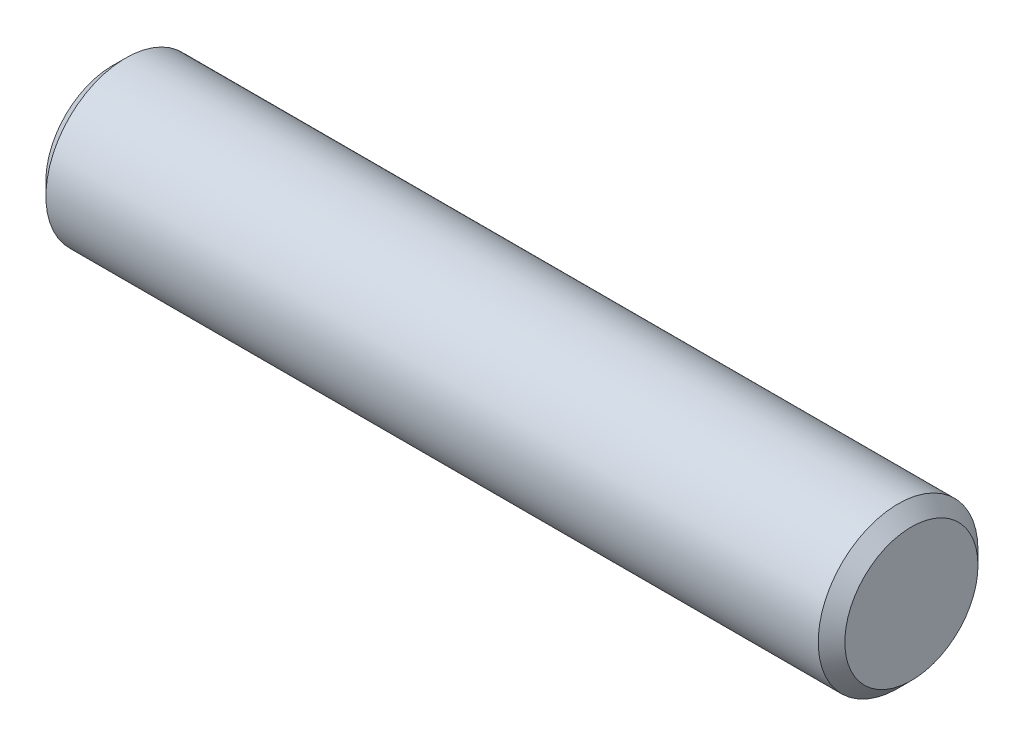
ISO-10303-21;
HEADER;
FILE_DESCRIPTION(('STEP AP214'),'2;1');
FILE_NAME('part.step','',(''),(''),'','','');
FILE_SCHEMA(('AUTOMOTIVE_DESIGN { 1 0 10303 214 1 1 1 1 }'));
ENDSEC;
DATA;
#1=APPLICATION_CONTEXT('core data for automotive mechanical design processes');
#2=APPLICATION_PROTOCOL_DEFINITION('international standard','automotive_design',2000,#1);
#3=PRODUCT_CONTEXT('',#1,'mechanical');
#4=PRODUCT('Part','Part','',(#3));
#5=PRODUCT_RELATED_PRODUCT_CATEGORY('part','',(#4));
#6=PRODUCT_DEFINITION_FORMATION('','',#4);
#7=PRODUCT_DEFINITION_CONTEXT('part definition',#1,'design');
#8=PRODUCT_DEFINITION('design','',#6,#7);
#9=PRODUCT_DEFINITION_SHAPE('','',#8);
#10=(LENGTH_UNIT() NAMED_UNIT(*) SI_UNIT(.MILLI.,.METRE.));
#11=(NAMED_UNIT(*) PLANE_ANGLE_UNIT() SI_UNIT($,.RADIAN.));
#12=(NAMED_UNIT(*) SI_UNIT($,.STERADIAN.) SOLID_ANGLE_UNIT());
#13=UNCERTAINTY_MEASURE_WITH_UNIT(LENGTH_MEASURE(1.E-05),#10,'distance_accuracy_value','');
#14=(GEOMETRIC_REPRESENTATION_CONTEXT(3) GLOBAL_UNCERTAINTY_ASSIGNED_CONTEXT((#13)) GLOBAL_UNIT_ASSIGNED_CONTEXT((#10,
#11,#12)) REPRESENTATION_CONTEXT('',''));
#15=CARTESIAN_POINT('',(0.,0.,0.));
#16=DIRECTION('',(0.,0.,1.));
#17=DIRECTION('',(1.,0.,0.));
#18=AXIS2_PLACEMENT_3D('',#15,#16,#17);
#19=CARTESIAN_POINT('',(15.,0.,0.));
#20=DIRECTION('',(-1.,0.,0.));
#21=DIRECTION('',(0.,0.,1.));
#22=AXIS2_PLACEMENT_3D('',#19,#20,#21);
#23=CYLINDRICAL_SURFACE('',#22,3.);
#24=CARTESIAN_POINT('',(-14.5,0.,0.));
#25=DIRECTION('',(1.,0.,0.));
#26=DIRECTION('',(0.,0.,-1.));
#27=AXIS2_PLACEMENT_3D('',#24,#25,#26);
#28=CIRCLE('',#27,3.);
#29=CARTESIAN_POINT('',(-14.5,0.,-3.));
#30=VERTEX_POINT('',#29);
#31=EDGE_CURVE('E47',#30,#30,#28,.T.);
#32=ORIENTED_EDGE('',*,*,#31,.T.);
#33=EDGE_LOOP('',(#32));
#34=FACE_BOUND('',#33,.T.);
#35=CARTESIAN_POINT('',(14.5,0.,0.));
#36=DIRECTION('',(1.,0.,0.));
#37=DIRECTION('',(0.,0.,-1.));
#38=AXIS2_PLACEMENT_3D('',#35,#36,#37);
#39=CIRCLE('',#38,3.);
#40=CARTESIAN_POINT('',(14.5,0.,-3.));
#41=VERTEX_POINT('',#40);
#42=EDGE_CURVE('E51',#41,#41,#39,.F.);
#43=ORIENTED_EDGE('',*,*,#42,.T.);
#44=EDGE_LOOP('',(#43));
#45=FACE_BOUND('',#44,.T.);
#46=ADVANCED_FACE('F35',(#34,#45),#23,.T.);
#47=CARTESIAN_POINT('',(15.,0.,0.));
#48=DIRECTION('',(1.,0.,0.));
#49=DIRECTION('',(0.,0.,-1.));
#50=AXIS2_PLACEMENT_3D('',#47,#48,#49);
#51=PLANE('',#50);
#52=CARTESIAN_POINT('',(15.,0.,0.));
#53=DIRECTION('',(1.,0.,0.));
#54=DIRECTION('',(0.,0.,-1.));
#55=AXIS2_PLACEMENT_3D('',#52,#53,#54);
#56=CIRCLE('',#55,2.5);
#57=CARTESIAN_POINT('',(15.,0.,-2.5));
#58=VERTEX_POINT('',#57);
#59=EDGE_CURVE('E10',#58,#58,#56,.T.);
#60=ORIENTED_EDGE('',*,*,#59,.T.);
#61=EDGE_LOOP('',(#60));
#62=FACE_BOUND('',#61,.T.);
#63=ADVANCED_FACE('F67',(#62),#51,.T.);
#64=CARTESIAN_POINT('',(-15.,0.,0.));
#65=DIRECTION('',(1.,0.,0.));
#66=DIRECTION('',(0.,0.,-1.));
#67=AXIS2_PLACEMENT_3D('',#64,#65,#66);
#68=PLANE('',#67);
#69=CARTESIAN_POINT('',(-15.,0.,0.));
#70=DIRECTION('',(1.,0.,0.));
#71=DIRECTION('',(0.,0.,-1.));
#72=AXIS2_PLACEMENT_3D('',#69,#70,#71);
#73=CIRCLE('',#72,2.5);
#74=CARTESIAN_POINT('',(-15.,0.,-2.5));
#75=VERTEX_POINT('',#74);
#76=EDGE_CURVE('E43',#75,#75,#73,.F.);
#77=ORIENTED_EDGE('',*,*,#76,.T.);
#78=EDGE_LOOP('',(#77));
#79=FACE_BOUND('',#78,.T.);
#80=ADVANCED_FACE('F64',(#79),#68,.F.);
#81=CARTESIAN_POINT('',(-14.5,0.,0.));
#82=DIRECTION('',(1.,0.,0.));
#83=DIRECTION('',(0.,0.,-1.));
#84=AXIS2_PLACEMENT_3D('',#81,#82,#83);
#85=CONICAL_SURFACE('',#84,3.,0.785398163397449);
#86=ORIENTED_EDGE('',*,*,#76,.F.);
#87=EDGE_LOOP('',(#86));
#88=FACE_BOUND('',#87,.T.);
#89=ORIENTED_EDGE('',*,*,#31,.F.);
#90=EDGE_LOOP('',(#89));
#91=FACE_BOUND('',#90,.T.);
#92=ADVANCED_FACE('F60',(#88,#91),#85,.T.);
#93=CARTESIAN_POINT('',(15.,0.,0.));
#94=DIRECTION('',(-1.,0.,0.));
#95=DIRECTION('',(0.,0.,1.));
#96=AXIS2_PLACEMENT_3D('',#93,#94,#95);
#97=CONICAL_SURFACE('',#96,2.5,0.785398163397445);
#98=ORIENTED_EDGE('',*,*,#42,.F.);
#99=EDGE_LOOP('',(#98));
#100=FACE_BOUND('',#99,.T.);
#101=ORIENTED_EDGE('',*,*,#59,.F.);
#102=EDGE_LOOP('',(#101));
#103=FACE_BOUND('',#102,.T.);
#104=ADVANCED_FACE('F38',(#100,#103),#97,.T.);
#105=CLOSED_SHELL('',(#46,#63,#80,#92,#104));
#106=MANIFOLD_SOLID_BREP('B2',#105);
#107=ADVANCED_BREP_SHAPE_REPRESENTATION('',(#18,#106),#14);
#108=SHAPE_DEFINITION_REPRESENTATION(#9,#107);
ENDSEC;
END-ISO-10303-21;
